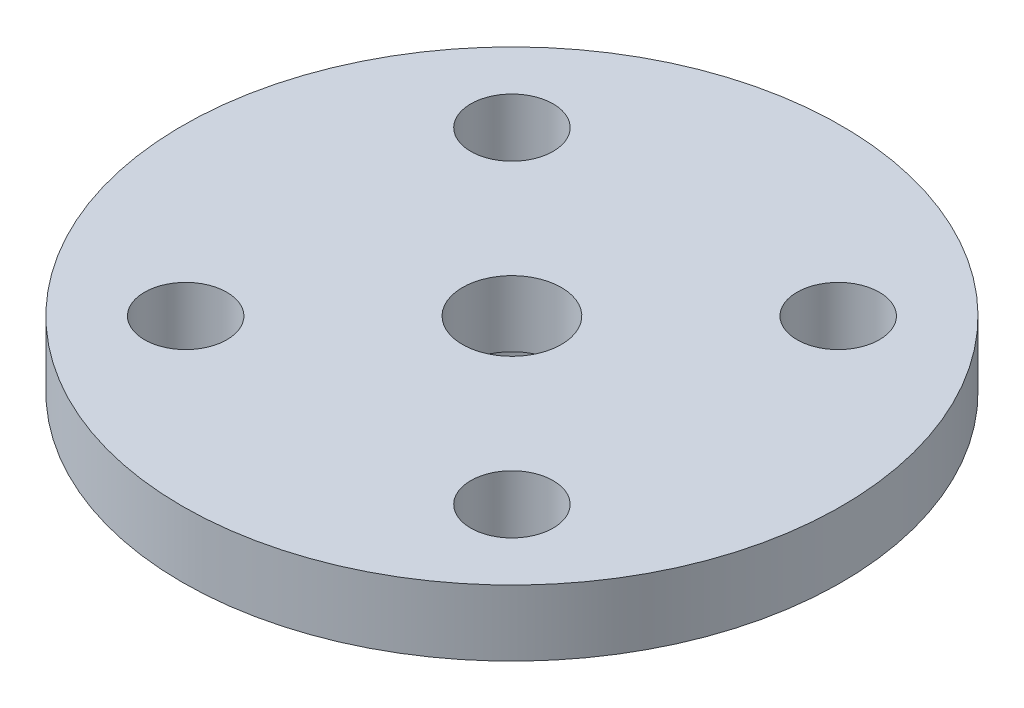
ISO-10303-21;
HEADER;
FILE_DESCRIPTION(('STEP AP214'),'2;1');
FILE_NAME('part.step','',(''),(''),'','','');
FILE_SCHEMA(('AUTOMOTIVE_DESIGN { 1 0 10303 214 1 1 1 1 }'));
ENDSEC;
DATA;
#1=APPLICATION_CONTEXT('core data for automotive mechanical design processes');
#2=APPLICATION_PROTOCOL_DEFINITION('international standard','automotive_design',2000,#1);
#3=PRODUCT_CONTEXT('',#1,'mechanical');
#4=PRODUCT('Part','Part','',(#3));
#5=PRODUCT_RELATED_PRODUCT_CATEGORY('part','',(#4));
#6=PRODUCT_DEFINITION_FORMATION('','',#4);
#7=PRODUCT_DEFINITION_CONTEXT('part definition',#1,'design');
#8=PRODUCT_DEFINITION('design','',#6,#7);
#9=PRODUCT_DEFINITION_SHAPE('','',#8);
#10=(LENGTH_UNIT() NAMED_UNIT(*) SI_UNIT(.MILLI.,.METRE.));
#11=(NAMED_UNIT(*) PLANE_ANGLE_UNIT() SI_UNIT($,.RADIAN.));
#12=(NAMED_UNIT(*) SI_UNIT($,.STERADIAN.) SOLID_ANGLE_UNIT());
#13=UNCERTAINTY_MEASURE_WITH_UNIT(LENGTH_MEASURE(1.E-05),#10,'distance_accuracy_value','');
#14=(GEOMETRIC_REPRESENTATION_CONTEXT(3) GLOBAL_UNCERTAINTY_ASSIGNED_CONTEXT((#13)) GLOBAL_UNIT_ASSIGNED_CONTEXT((#10,
#11,#12)) REPRESENTATION_CONTEXT('',''));
#15=CARTESIAN_POINT('',(0.,0.,0.));
#16=DIRECTION('',(0.,0.,1.));
#17=DIRECTION('',(1.,0.,0.));
#18=AXIS2_PLACEMENT_3D('',#15,#16,#17);
#19=CARTESIAN_POINT('',(0.,0.,0.));
#20=DIRECTION('',(0.,1.,0.));
#21=DIRECTION('',(0.,0.,1.));
#22=AXIS2_PLACEMENT_3D('',#19,#20,#21);
#23=PLANE('',#22);
#24=CARTESIAN_POINT('',(0.,0.,0.));
#25=DIRECTION('',(0.,-1.,0.));
#26=DIRECTION('',(0.,0.,-1.));
#27=AXIS2_PLACEMENT_3D('',#24,#25,#26);
#28=CIRCLE('',#27,1.5);
#29=CARTESIAN_POINT('',(0.,0.,-1.5));
#30=VERTEX_POINT('',#29);
#31=EDGE_CURVE('E97',#30,#30,#28,.T.);
#32=ORIENTED_EDGE('',*,*,#31,.T.);
#33=EDGE_LOOP('',(#32));
#34=FACE_BOUND('',#33,.T.);
#35=CARTESIAN_POINT('',(-4.94974746830583,0.,-4.94974746830583));
#36=DIRECTION('',(0.,-1.,0.));
#37=DIRECTION('',(0.,0.,-1.));
#38=AXIS2_PLACEMENT_3D('',#35,#36,#37);
#39=CIRCLE('',#38,1.24999999999999);
#40=CARTESIAN_POINT('',(-4.94974746830583,0.,-6.19974746830582));
#41=VERTEX_POINT('',#40);
#42=EDGE_CURVE('E82',#41,#41,#39,.T.);
#43=ORIENTED_EDGE('',*,*,#42,.T.);
#44=EDGE_LOOP('',(#43));
#45=FACE_BOUND('',#44,.T.);
#46=CARTESIAN_POINT('',(4.94974746830583,0.,4.94974746830583));
#47=DIRECTION('',(0.,-1.,0.));
#48=DIRECTION('',(0.,0.,-1.));
#49=AXIS2_PLACEMENT_3D('',#46,#47,#48);
#50=CIRCLE('',#49,1.24999999999999);
#51=CARTESIAN_POINT('',(4.94974746830583,0.,3.69974746830584));
#52=VERTEX_POINT('',#51);
#53=EDGE_CURVE('E73',#52,#52,#50,.T.);
#54=ORIENTED_EDGE('',*,*,#53,.T.);
#55=EDGE_LOOP('',(#54));
#56=FACE_BOUND('',#55,.T.);
#57=CARTESIAN_POINT('',(4.94974746830583,0.,-4.94974746830583));
#58=DIRECTION('',(0.,-1.,0.));
#59=DIRECTION('',(0.,0.,-1.));
#60=AXIS2_PLACEMENT_3D('',#57,#58,#59);
#61=CIRCLE('',#60,1.24999999999999);
#62=CARTESIAN_POINT('',(4.94974746830583,0.,-6.19974746830582));
#63=VERTEX_POINT('',#62);
#64=EDGE_CURVE('E64',#63,#63,#61,.T.);
#65=ORIENTED_EDGE('',*,*,#64,.T.);
#66=EDGE_LOOP('',(#65));
#67=FACE_BOUND('',#66,.T.);
#68=CARTESIAN_POINT('',(-4.94974746830583,0.,4.94974746830583));
#69=DIRECTION('',(0.,-1.,0.));
#70=DIRECTION('',(0.,0.,-1.));
#71=AXIS2_PLACEMENT_3D('',#68,#69,#70);
#72=CIRCLE('',#71,1.24999999999999);
#73=CARTESIAN_POINT('',(-4.94974746830583,0.,3.69974746830585));
#74=VERTEX_POINT('',#73);
#75=EDGE_CURVE('E55',#74,#74,#72,.T.);
#76=ORIENTED_EDGE('',*,*,#75,.T.);
#77=EDGE_LOOP('',(#76));
#78=FACE_BOUND('',#77,.T.);
#79=CARTESIAN_POINT('',(0.,0.,0.));
#80=DIRECTION('',(0.,1.,0.));
#81=DIRECTION('',(0.,0.,1.));
#82=AXIS2_PLACEMENT_3D('',#79,#80,#81);
#83=CIRCLE('',#82,10.);
#84=CARTESIAN_POINT('',(0.,0.,10.));
#85=VERTEX_POINT('',#84);
#86=EDGE_CURVE('E10',#85,#85,#83,.T.);
#87=ORIENTED_EDGE('',*,*,#86,.T.);
#88=EDGE_LOOP('',(#87));
#89=FACE_BOUND('',#88,.T.);
#90=ADVANCED_FACE('F36',(#34,#45,#56,#67,#78,#89),#23,.T.);
#91=CARTESIAN_POINT('',(0.,0.,0.));
#92=DIRECTION('',(0.,1.,0.));
#93=DIRECTION('',(0.,0.,1.));
#94=AXIS2_PLACEMENT_3D('',#91,#92,#93);
#95=CYLINDRICAL_SURFACE('',#94,10.);
#96=CARTESIAN_POINT('',(0.,-2.,0.));
#97=DIRECTION('',(0.,1.,0.));
#98=DIRECTION('',(0.,0.,1.));
#99=AXIS2_PLACEMENT_3D('',#96,#97,#98);
#100=CIRCLE('',#99,10.);
#101=CARTESIAN_POINT('',(0.,-2.,10.));
#102=VERTEX_POINT('',#101);
#103=EDGE_CURVE('E42',#102,#102,#100,.T.);
#104=ORIENTED_EDGE('',*,*,#103,.T.);
#105=EDGE_LOOP('',(#104));
#106=FACE_BOUND('',#105,.T.);
#107=ORIENTED_EDGE('',*,*,#86,.F.);
#108=EDGE_LOOP('',(#107));
#109=FACE_BOUND('',#108,.T.);
#110=ADVANCED_FACE('F141',(#106,#109),#95,.T.);
#111=CARTESIAN_POINT('',(0.,-2.,10.));
#112=DIRECTION('',(0.,-1.,0.));
#113=DIRECTION('',(0.,0.,-1.));
#114=AXIS2_PLACEMENT_3D('',#111,#112,#113);
#115=PLANE('',#114);
#116=CARTESIAN_POINT('',(-4.94974746830583,-2.,-4.94974746830583));
#117=DIRECTION('',(0.,-1.,0.));
#118=DIRECTION('',(0.,0.,-1.));
#119=AXIS2_PLACEMENT_3D('',#116,#117,#118);
#120=CIRCLE('',#119,1.275);
#121=CARTESIAN_POINT('',(-4.94974746830583,-2.,-6.22474746830583));
#122=VERTEX_POINT('',#121);
#123=EDGE_CURVE('E88',#122,#122,#120,.T.);
#124=ORIENTED_EDGE('',*,*,#123,.F.);
#125=EDGE_LOOP('',(#124));
#126=FACE_BOUND('',#125,.T.);
#127=CARTESIAN_POINT('',(4.94974746830583,-2.,4.94974746830583));
#128=DIRECTION('',(0.,-1.,0.));
#129=DIRECTION('',(0.,0.,-1.));
#130=AXIS2_PLACEMENT_3D('',#127,#128,#129);
#131=CIRCLE('',#130,1.275);
#132=CARTESIAN_POINT('',(4.94974746830583,-2.,3.67474746830583));
#133=VERTEX_POINT('',#132);
#134=EDGE_CURVE('E79',#133,#133,#131,.T.);
#135=ORIENTED_EDGE('',*,*,#134,.F.);
#136=EDGE_LOOP('',(#135));
#137=FACE_BOUND('',#136,.T.);
#138=CARTESIAN_POINT('',(4.94974746830583,-2.,-4.94974746830583));
#139=DIRECTION('',(0.,-1.,0.));
#140=DIRECTION('',(0.,0.,-1.));
#141=AXIS2_PLACEMENT_3D('',#138,#139,#140);
#142=CIRCLE('',#141,1.275);
#143=CARTESIAN_POINT('',(4.94974746830583,-2.,-6.22474746830583));
#144=VERTEX_POINT('',#143);
#145=EDGE_CURVE('E70',#144,#144,#142,.T.);
#146=ORIENTED_EDGE('',*,*,#145,.F.);
#147=EDGE_LOOP('',(#146));
#148=FACE_BOUND('',#147,.T.);
#149=CARTESIAN_POINT('',(-4.94974746830583,-2.,4.94974746830583));
#150=DIRECTION('',(0.,-1.,0.));
#151=DIRECTION('',(0.,0.,-1.));
#152=AXIS2_PLACEMENT_3D('',#149,#150,#151);
#153=CIRCLE('',#152,1.275);
#154=CARTESIAN_POINT('',(-4.94974746830583,-2.,3.67474746830583));
#155=VERTEX_POINT('',#154);
#156=EDGE_CURVE('E61',#155,#155,#153,.T.);
#157=ORIENTED_EDGE('',*,*,#156,.F.);
#158=EDGE_LOOP('',(#157));
#159=FACE_BOUND('',#158,.T.);
#160=CARTESIAN_POINT('',(0.,-2.,0.));
#161=DIRECTION('',(0.,1.,0.));
#162=DIRECTION('',(0.,0.,1.));
#163=AXIS2_PLACEMENT_3D('',#160,#161,#162);
#164=CIRCLE('',#163,4.5);
#165=CARTESIAN_POINT('',(0.,-2.,4.5));
#166=VERTEX_POINT('',#165);
#167=EDGE_CURVE('E46',#166,#166,#164,.T.);
#168=ORIENTED_EDGE('',*,*,#167,.T.);
#169=EDGE_LOOP('',(#168));
#170=FACE_BOUND('',#169,.T.);
#171=ORIENTED_EDGE('',*,*,#103,.F.);
#172=EDGE_LOOP('',(#171));
#173=FACE_BOUND('',#172,.T.);
#174=ADVANCED_FACE('F135',(#126,#137,#148,#159,#170,#173),#115,.T.);
#175=CARTESIAN_POINT('',(0.,0.,0.));
#176=DIRECTION('',(0.,1.,0.));
#177=DIRECTION('',(0.,0.,1.));
#178=AXIS2_PLACEMENT_3D('',#175,#176,#177);
#179=CYLINDRICAL_SURFACE('',#178,4.5);
#180=CARTESIAN_POINT('',(0.,-5.,0.));
#181=DIRECTION('',(0.,1.,0.));
#182=DIRECTION('',(0.,0.,1.));
#183=AXIS2_PLACEMENT_3D('',#180,#181,#182);
#184=CIRCLE('',#183,4.5);
#185=CARTESIAN_POINT('',(0.,-5.,4.5));
#186=VERTEX_POINT('',#185);
#187=EDGE_CURVE('E50',#186,#186,#184,.T.);
#188=ORIENTED_EDGE('',*,*,#187,.T.);
#189=EDGE_LOOP('',(#188));
#190=FACE_BOUND('',#189,.T.);
#191=ORIENTED_EDGE('',*,*,#167,.F.);
#192=EDGE_LOOP('',(#191));
#193=FACE_BOUND('',#192,.T.);
#194=ADVANCED_FACE('F129',(#190,#193),#179,.T.);
#195=CARTESIAN_POINT('',(0.,-5.,4.5));
#196=DIRECTION('',(0.,-1.,0.));
#197=DIRECTION('',(0.,0.,-1.));
#198=AXIS2_PLACEMENT_3D('',#195,#196,#197);
#199=PLANE('',#198);
#200=CARTESIAN_POINT('',(0.,-5.,0.));
#201=DIRECTION('',(0.,-1.,0.));
#202=DIRECTION('',(0.,0.,-1.));
#203=AXIS2_PLACEMENT_3D('',#200,#201,#202);
#204=CIRCLE('',#203,2.75);
#205=CARTESIAN_POINT('',(0.,-5.,-2.75));
#206=VERTEX_POINT('',#205);
#207=EDGE_CURVE('E94',#206,#206,#204,.T.);
#208=ORIENTED_EDGE('',*,*,#207,.F.);
#209=EDGE_LOOP('',(#208));
#210=FACE_BOUND('',#209,.T.);
#211=ORIENTED_EDGE('',*,*,#187,.F.);
#212=EDGE_LOOP('',(#211));
#213=FACE_BOUND('',#212,.T.);
#214=ADVANCED_FACE('F125',(#210,#213),#199,.T.);
#215=CARTESIAN_POINT('',(-4.94974746830583,-2.,4.94974746830583));
#216=DIRECTION('',(0.,-1.,0.));
#217=DIRECTION('',(0.,0.,-1.));
#218=AXIS2_PLACEMENT_3D('',#215,#216,#217);
#219=CYLINDRICAL_SURFACE('',#218,1.24999999999999);
#220=ORIENTED_EDGE('',*,*,#75,.F.);
#221=EDGE_LOOP('',(#220));
#222=FACE_BOUND('',#221,.T.);
#223=CARTESIAN_POINT('',(-4.94974746830583,-1.975,4.94974746830583));
#224=DIRECTION('',(0.,-1.,0.));
#225=DIRECTION('',(0.,0.,-1.));
#226=AXIS2_PLACEMENT_3D('',#223,#224,#225);
#227=CIRCLE('',#226,1.25);
#228=CARTESIAN_POINT('',(-4.94974746830583,-1.975,3.69974746830583));
#229=VERTEX_POINT('',#228);
#230=EDGE_CURVE('E58',#229,#229,#227,.T.);
#231=ORIENTED_EDGE('',*,*,#230,.T.);
#232=EDGE_LOOP('',(#231));
#233=FACE_BOUND('',#232,.T.);
#234=ADVANCED_FACE('F128',(#222,#233),#219,.F.);
#235=CARTESIAN_POINT('',(-4.94974746830583,-2.,4.94974746830583));
#236=DIRECTION('',(0.,-1.,0.));
#237=DIRECTION('',(0.,0.,-1.));
#238=AXIS2_PLACEMENT_3D('',#235,#236,#237);
#239=CONICAL_SURFACE('',#238,1.275,0.785398163397422);
#240=ORIENTED_EDGE('',*,*,#230,.F.);
#241=EDGE_LOOP('',(#240));
#242=FACE_BOUND('',#241,.T.);
#243=ORIENTED_EDGE('',*,*,#156,.T.);
#244=EDGE_LOOP('',(#243));
#245=FACE_BOUND('',#244,.T.);
#246=ADVANCED_FACE('F179',(#242,#245),#239,.F.);
#247=CARTESIAN_POINT('',(4.94974746830583,-2.,-4.94974746830583));
#248=DIRECTION('',(0.,-1.,0.));
#249=DIRECTION('',(0.,0.,-1.));
#250=AXIS2_PLACEMENT_3D('',#247,#248,#249);
#251=CYLINDRICAL_SURFACE('',#250,1.24999999999999);
#252=ORIENTED_EDGE('',*,*,#64,.F.);
#253=EDGE_LOOP('',(#252));
#254=FACE_BOUND('',#253,.T.);
#255=CARTESIAN_POINT('',(4.94974746830583,-1.975,-4.94974746830583));
#256=DIRECTION('',(0.,-1.,0.));
#257=DIRECTION('',(0.,0.,-1.));
#258=AXIS2_PLACEMENT_3D('',#255,#256,#257);
#259=CIRCLE('',#258,1.25);
#260=CARTESIAN_POINT('',(4.94974746830583,-1.975,-6.19974746830583));
#261=VERTEX_POINT('',#260);
#262=EDGE_CURVE('E67',#261,#261,#259,.T.);
#263=ORIENTED_EDGE('',*,*,#262,.T.);
#264=EDGE_LOOP('',(#263));
#265=FACE_BOUND('',#264,.T.);
#266=ADVANCED_FACE('F192',(#254,#265),#251,.F.);
#267=CARTESIAN_POINT('',(4.94974746830583,-2.,-4.94974746830583));
#268=DIRECTION('',(0.,-1.,0.));
#269=DIRECTION('',(0.,0.,-1.));
#270=AXIS2_PLACEMENT_3D('',#267,#268,#269);
#271=CONICAL_SURFACE('',#270,1.275,0.785398163397431);
#272=ORIENTED_EDGE('',*,*,#262,.F.);
#273=EDGE_LOOP('',(#272));
#274=FACE_BOUND('',#273,.T.);
#275=ORIENTED_EDGE('',*,*,#145,.T.);
#276=EDGE_LOOP('',(#275));
#277=FACE_BOUND('',#276,.T.);
#278=ADVANCED_FACE('F204',(#274,#277),#271,.F.);
#279=CARTESIAN_POINT('',(4.94974746830583,-2.,4.94974746830583));
#280=DIRECTION('',(0.,-1.,0.));
#281=DIRECTION('',(0.,0.,-1.));
#282=AXIS2_PLACEMENT_3D('',#279,#280,#281);
#283=CYLINDRICAL_SURFACE('',#282,1.24999999999999);
#284=ORIENTED_EDGE('',*,*,#53,.F.);
#285=EDGE_LOOP('',(#284));
#286=FACE_BOUND('',#285,.T.);
#287=CARTESIAN_POINT('',(4.94974746830583,-1.975,4.94974746830583));
#288=DIRECTION('',(0.,-1.,0.));
#289=DIRECTION('',(0.,0.,-1.));
#290=AXIS2_PLACEMENT_3D('',#287,#288,#289);
#291=CIRCLE('',#290,1.25);
#292=CARTESIAN_POINT('',(4.94974746830583,-1.975,3.69974746830583));
#293=VERTEX_POINT('',#292);
#294=EDGE_CURVE('E76',#293,#293,#291,.T.);
#295=ORIENTED_EDGE('',*,*,#294,.T.);
#296=EDGE_LOOP('',(#295));
#297=FACE_BOUND('',#296,.T.);
#298=ADVANCED_FACE('F217',(#286,#297),#283,.F.);
#299=CARTESIAN_POINT('',(4.94974746830583,-2.,4.94974746830583));
#300=DIRECTION('',(0.,-1.,0.));
#301=DIRECTION('',(0.,0.,-1.));
#302=AXIS2_PLACEMENT_3D('',#299,#300,#301);
#303=CONICAL_SURFACE('',#302,1.275,0.785398163397431);
#304=ORIENTED_EDGE('',*,*,#294,.F.);
#305=EDGE_LOOP('',(#304));
#306=FACE_BOUND('',#305,.T.);
#307=ORIENTED_EDGE('',*,*,#134,.T.);
#308=EDGE_LOOP('',(#307));
#309=FACE_BOUND('',#308,.T.);
#310=ADVANCED_FACE('F229',(#306,#309),#303,.F.);
#311=CARTESIAN_POINT('',(-4.94974746830583,-2.,-4.94974746830583));
#312=DIRECTION('',(0.,-1.,0.));
#313=DIRECTION('',(0.,0.,-1.));
#314=AXIS2_PLACEMENT_3D('',#311,#312,#313);
#315=CYLINDRICAL_SURFACE('',#314,1.24999999999999);
#316=ORIENTED_EDGE('',*,*,#42,.F.);
#317=EDGE_LOOP('',(#316));
#318=FACE_BOUND('',#317,.T.);
#319=CARTESIAN_POINT('',(-4.94974746830583,-1.975,-4.94974746830583));
#320=DIRECTION('',(0.,-1.,0.));
#321=DIRECTION('',(0.,0.,-1.));
#322=AXIS2_PLACEMENT_3D('',#319,#320,#321);
#323=CIRCLE('',#322,1.25);
#324=CARTESIAN_POINT('',(-4.94974746830583,-1.975,-6.19974746830583));
#325=VERTEX_POINT('',#324);
#326=EDGE_CURVE('E85',#325,#325,#323,.T.);
#327=ORIENTED_EDGE('',*,*,#326,.T.);
#328=EDGE_LOOP('',(#327));
#329=FACE_BOUND('',#328,.T.);
#330=ADVANCED_FACE('F240',(#318,#329),#315,.F.);
#331=CARTESIAN_POINT('',(-4.94974746830583,-2.,-4.94974746830583));
#332=DIRECTION('',(0.,-1.,0.));
#333=DIRECTION('',(0.,0.,-1.));
#334=AXIS2_PLACEMENT_3D('',#331,#332,#333);
#335=CONICAL_SURFACE('',#334,1.275,0.785398163397422);
#336=ORIENTED_EDGE('',*,*,#326,.F.);
#337=EDGE_LOOP('',(#336));
#338=FACE_BOUND('',#337,.T.);
#339=ORIENTED_EDGE('',*,*,#123,.T.);
#340=EDGE_LOOP('',(#339));
#341=FACE_BOUND('',#340,.T.);
#342=ADVANCED_FACE('F121',(#338,#341),#335,.F.);
#343=CARTESIAN_POINT('',(0.,5.77817459305202,0.));
#344=DIRECTION('',(0.,-1.,0.));
#345=DIRECTION('',(0.,0.,-1.));
#346=AXIS2_PLACEMENT_3D('',#343,#344,#345);
#347=CYLINDRICAL_SURFACE('',#346,2.75);
#348=CARTESIAN_POINT('',(0.,-2.,0.));
#349=DIRECTION('',(0.,-1.,0.));
#350=DIRECTION('',(0.,0.,-1.));
#351=AXIS2_PLACEMENT_3D('',#348,#349,#350);
#352=CIRCLE('',#351,2.75);
#353=CARTESIAN_POINT('',(0.,-2.,-2.75));
#354=VERTEX_POINT('',#353);
#355=EDGE_CURVE('E91',#354,#354,#352,.F.);
#356=ORIENTED_EDGE('',*,*,#355,.T.);
#357=EDGE_LOOP('',(#356));
#358=FACE_BOUND('',#357,.T.);
#359=ORIENTED_EDGE('',*,*,#207,.T.);
#360=EDGE_LOOP('',(#359));
#361=FACE_BOUND('',#360,.T.);
#362=ADVANCED_FACE('F115',(#358,#361),#347,.F.);
#363=CARTESIAN_POINT('',(0.,-2.,10.));
#364=DIRECTION('',(0.,-1.,0.));
#365=DIRECTION('',(0.,0.,-1.));
#366=AXIS2_PLACEMENT_3D('',#363,#364,#365);
#367=PLANE('',#366);
#368=CARTESIAN_POINT('',(0.,-2.,0.));
#369=DIRECTION('',(0.,-1.,0.));
#370=DIRECTION('',(0.,0.,-1.));
#371=AXIS2_PLACEMENT_3D('',#368,#369,#370);
#372=CIRCLE('',#371,1.5);
#373=CARTESIAN_POINT('',(0.,-2.,-1.5));
#374=VERTEX_POINT('',#373);
#375=EDGE_CURVE('E98',#374,#374,#372,.T.);
#376=ORIENTED_EDGE('',*,*,#375,.F.);
#377=EDGE_LOOP('',(#376));
#378=FACE_BOUND('',#377,.T.);
#379=ORIENTED_EDGE('',*,*,#355,.F.);
#380=EDGE_LOOP('',(#379));
#381=FACE_BOUND('',#380,.T.);
#382=ADVANCED_FACE('F109',(#378,#381),#367,.T.);
#383=CARTESIAN_POINT('',(0.,0.,0.));
#384=DIRECTION('',(0.,-1.,0.));
#385=DIRECTION('',(0.,0.,-1.));
#386=AXIS2_PLACEMENT_3D('',#383,#384,#385);
#387=CYLINDRICAL_SURFACE('',#386,1.5);
#388=ORIENTED_EDGE('',*,*,#31,.F.);
#389=EDGE_LOOP('',(#388));
#390=FACE_BOUND('',#389,.T.);
#391=ORIENTED_EDGE('',*,*,#375,.T.);
#392=EDGE_LOOP('',(#391));
#393=FACE_BOUND('',#392,.T.);
#394=ADVANCED_FACE('F106',(#390,#393),#387,.F.);
#395=CLOSED_SHELL('',(#90,#110,#174,#194,#214,#234,#246,#266,#278,#298,#310,#330,#342,#362,#382,#394));
#396=MANIFOLD_SOLID_BREP('B2',#395);
#397=ADVANCED_BREP_SHAPE_REPRESENTATION('',(#18,#396),#14);
#398=SHAPE_DEFINITION_REPRESENTATION(#9,#397);
ENDSEC;
END-ISO-10303-21;
